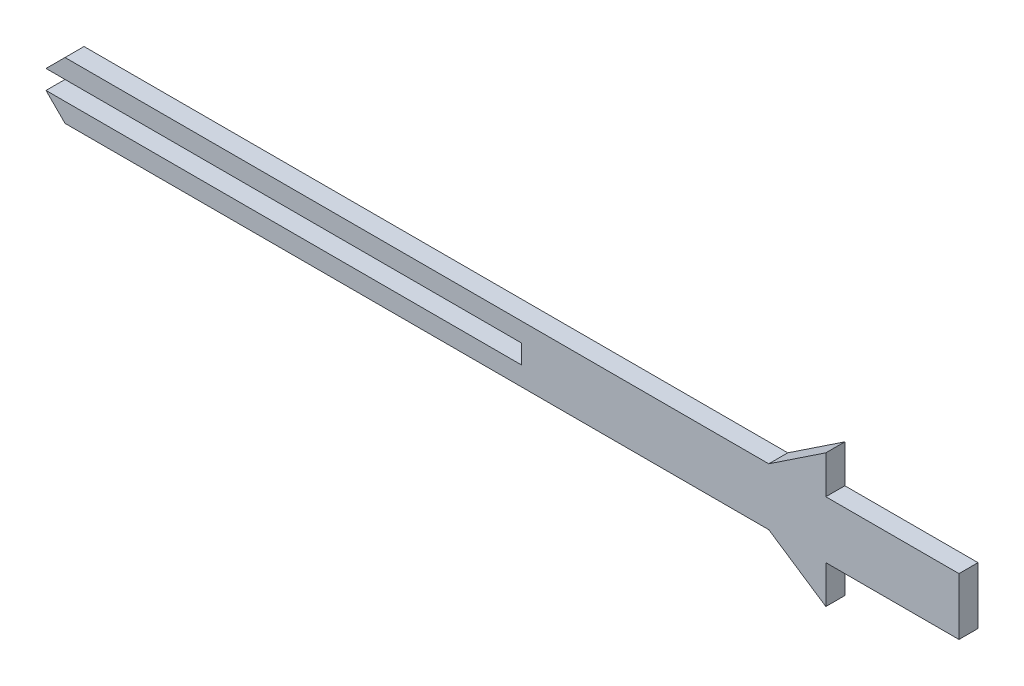
ISO-10303-21;
HEADER;
FILE_DESCRIPTION(('STEP AP214'),'2;1');
FILE_NAME('part.step','',(''),(''),'','','');
FILE_SCHEMA(('AUTOMOTIVE_DESIGN { 1 0 10303 214 1 1 1 1 }'));
ENDSEC;
DATA;
#1=APPLICATION_CONTEXT('core data for automotive mechanical design processes');
#2=APPLICATION_PROTOCOL_DEFINITION('international standard','automotive_design',2000,#1);
#3=PRODUCT_CONTEXT('',#1,'mechanical');
#4=PRODUCT('Part','Part','',(#3));
#5=PRODUCT_RELATED_PRODUCT_CATEGORY('part','',(#4));
#6=PRODUCT_DEFINITION_FORMATION('','',#4);
#7=PRODUCT_DEFINITION_CONTEXT('part definition',#1,'design');
#8=PRODUCT_DEFINITION('design','',#6,#7);
#9=PRODUCT_DEFINITION_SHAPE('','',#8);
#10=(LENGTH_UNIT() NAMED_UNIT(*) SI_UNIT(.MILLI.,.METRE.));
#11=(NAMED_UNIT(*) PLANE_ANGLE_UNIT() SI_UNIT($,.RADIAN.));
#12=(NAMED_UNIT(*) SI_UNIT($,.STERADIAN.) SOLID_ANGLE_UNIT());
#13=UNCERTAINTY_MEASURE_WITH_UNIT(LENGTH_MEASURE(1.E-05),#10,'distance_accuracy_value','');
#14=(GEOMETRIC_REPRESENTATION_CONTEXT(3) GLOBAL_UNCERTAINTY_ASSIGNED_CONTEXT((#13)) GLOBAL_UNIT_ASSIGNED_CONTEXT((#10,
#11,#12)) REPRESENTATION_CONTEXT('',''));
#15=CARTESIAN_POINT('',(0.,0.,0.));
#16=DIRECTION('',(0.,0.,1.));
#17=DIRECTION('',(1.,0.,0.));
#18=AXIS2_PLACEMENT_3D('',#15,#16,#17);
#19=CARTESIAN_POINT('',(346.292523509895,15.0172440967176,3.));
#20=DIRECTION('',(0.,1.,0.));
#21=DIRECTION('',(0.,0.,1.));
#22=AXIS2_PLACEMENT_3D('',#19,#20,#21);
#23=PLANE('',#22);
#24=DIRECTION('',(1.,0.,0.));
#25=VECTOR('',#24,1.);
#26=CARTESIAN_POINT('',(346.292523509895,15.0172440967176,0.));
#27=LINE('',#26,#25);
#28=CARTESIAN_POINT('',(346.292523509895,15.0172440967176,0.));
#29=VERTEX_POINT('',#28);
#30=CARTESIAN_POINT('',(421.292523509895,15.0172440967176,0.));
#31=VERTEX_POINT('',#30);
#32=EDGE_CURVE('E166',#29,#31,#27,.T.);
#33=ORIENTED_EDGE('',*,*,#32,.T.);
#34=DIRECTION('',(0.,0.,-1.));
#35=VECTOR('',#34,1.);
#36=CARTESIAN_POINT('',(421.292523509895,15.0172440967176,3.));
#37=LINE('',#36,#35);
#38=CARTESIAN_POINT('',(421.292523509895,15.0172440967176,3.));
#39=VERTEX_POINT('',#38);
#40=EDGE_CURVE('E11',#39,#31,#37,.T.);
#41=ORIENTED_EDGE('',*,*,#40,.F.);
#42=DIRECTION('',(1.,0.,0.));
#43=VECTOR('',#42,1.);
#44=CARTESIAN_POINT('',(346.292523509895,15.0172440967176,3.));
#45=LINE('',#44,#43);
#46=CARTESIAN_POINT('',(346.292523509895,15.0172440967176,3.));
#47=VERTEX_POINT('',#46);
#48=EDGE_CURVE('E192',#47,#39,#45,.T.);
#49=ORIENTED_EDGE('',*,*,#48,.F.);
#50=DIRECTION('',(0.,0.,-1.));
#51=VECTOR('',#50,1.);
#52=CARTESIAN_POINT('',(346.292523509895,15.0172440967176,3.));
#53=LINE('',#52,#51);
#54=EDGE_CURVE('E162',#47,#29,#53,.T.);
#55=ORIENTED_EDGE('',*,*,#54,.T.);
#56=EDGE_LOOP('',(#33,#41,#49,#55));
#57=FACE_BOUND('',#56,.T.);
#58=ADVANCED_FACE('F34',(#57),#23,.F.);
#59=CARTESIAN_POINT('',(421.292523509895,15.0172440967176,3.));
#60=DIRECTION('',(1.,0.,0.));
#61=DIRECTION('',(0.,0.,-1.));
#62=AXIS2_PLACEMENT_3D('',#59,#60,#61);
#63=PLANE('',#62);
#64=DIRECTION('',(0.,-1.,0.));
#65=VECTOR('',#64,1.);
#66=CARTESIAN_POINT('',(421.292523509895,15.0172440967176,0.));
#67=LINE('',#66,#65);
#68=CARTESIAN_POINT('',(421.292523509895,12.0172440967176,0.));
#69=VERTEX_POINT('',#68);
#70=EDGE_CURVE('E169',#31,#69,#67,.T.);
#71=ORIENTED_EDGE('',*,*,#70,.T.);
#72=DIRECTION('',(0.,0.,-1.));
#73=VECTOR('',#72,1.);
#74=CARTESIAN_POINT('',(421.292523509895,12.0172440967176,3.));
#75=LINE('',#74,#73);
#76=CARTESIAN_POINT('',(421.292523509895,12.0172440967176,3.));
#77=VERTEX_POINT('',#76);
#78=EDGE_CURVE('E42',#77,#69,#75,.T.);
#79=ORIENTED_EDGE('',*,*,#78,.F.);
#80=DIRECTION('',(0.,-1.,0.));
#81=VECTOR('',#80,1.);
#82=CARTESIAN_POINT('',(421.292523509895,15.0172440967176,3.));
#83=LINE('',#82,#81);
#84=EDGE_CURVE('E111',#39,#77,#83,.T.);
#85=ORIENTED_EDGE('',*,*,#84,.F.);
#86=ORIENTED_EDGE('',*,*,#40,.T.);
#87=EDGE_LOOP('',(#71,#79,#85,#86));
#88=FACE_BOUND('',#87,.T.);
#89=ADVANCED_FACE('F280',(#88),#63,.F.);
#90=CARTESIAN_POINT('',(421.292523509895,12.0172440967176,3.));
#91=DIRECTION('',(0.,-1.,0.));
#92=DIRECTION('',(0.,0.,-1.));
#93=AXIS2_PLACEMENT_3D('',#90,#91,#92);
#94=PLANE('',#93);
#95=DIRECTION('',(-1.,0.,0.));
#96=VECTOR('',#95,1.);
#97=CARTESIAN_POINT('',(421.292523509895,12.0172440967176,0.));
#98=LINE('',#97,#96);
#99=CARTESIAN_POINT('',(346.292523509895,12.0172440967176,0.));
#100=VERTEX_POINT('',#99);
#101=EDGE_CURVE('E171',#69,#100,#98,.T.);
#102=ORIENTED_EDGE('',*,*,#101,.T.);
#103=DIRECTION('',(0.,0.,-1.));
#104=VECTOR('',#103,1.);
#105=CARTESIAN_POINT('',(346.292523509895,12.0172440967176,3.));
#106=LINE('',#105,#104);
#107=CARTESIAN_POINT('',(346.292523509895,12.0172440967176,3.));
#108=VERTEX_POINT('',#107);
#109=EDGE_CURVE('E217',#108,#100,#106,.T.);
#110=ORIENTED_EDGE('',*,*,#109,.F.);
#111=DIRECTION('',(-1.,0.,0.));
#112=VECTOR('',#111,1.);
#113=CARTESIAN_POINT('',(421.292523509895,12.0172440967176,3.));
#114=LINE('',#113,#112);
#115=EDGE_CURVE('E225',#77,#108,#114,.T.);
#116=ORIENTED_EDGE('',*,*,#115,.F.);
#117=ORIENTED_EDGE('',*,*,#78,.T.);
#118=EDGE_LOOP('',(#102,#110,#116,#117));
#119=FACE_BOUND('',#118,.T.);
#120=ADVANCED_FACE('F223',(#119),#94,.F.);
#121=CARTESIAN_POINT('',(346.292523509895,12.0172440967176,3.));
#122=DIRECTION('',(0.707106781186547,0.707106781186548,0.));
#123=DIRECTION('',(-0.707106781186548,0.707106781186547,0.));
#124=AXIS2_PLACEMENT_3D('',#121,#122,#123);
#125=PLANE('',#124);
#126=DIRECTION('',(0.707106781186548,-0.707106781186547,0.));
#127=VECTOR('',#126,1.);
#128=CARTESIAN_POINT('',(346.292523509895,12.0172440967176,0.));
#129=LINE('',#128,#127);
#130=CARTESIAN_POINT('',(349.292523509895,9.0172440967176,0.));
#131=VERTEX_POINT('',#130);
#132=EDGE_CURVE('E173',#100,#131,#129,.T.);
#133=ORIENTED_EDGE('',*,*,#132,.T.);
#134=DIRECTION('',(0.,0.,-1.));
#135=VECTOR('',#134,1.);
#136=CARTESIAN_POINT('',(349.292523509895,9.0172440967176,3.));
#137=LINE('',#136,#135);
#138=CARTESIAN_POINT('',(349.292523509895,9.0172440967176,3.));
#139=VERTEX_POINT('',#138);
#140=EDGE_CURVE('E214',#139,#131,#137,.T.);
#141=ORIENTED_EDGE('',*,*,#140,.F.);
#142=DIRECTION('',(0.707106781186548,-0.707106781186547,0.));
#143=VECTOR('',#142,1.);
#144=CARTESIAN_POINT('',(346.292523509895,12.0172440967176,3.));
#145=LINE('',#144,#143);
#146=EDGE_CURVE('E243',#108,#139,#145,.T.);
#147=ORIENTED_EDGE('',*,*,#146,.F.);
#148=ORIENTED_EDGE('',*,*,#109,.T.);
#149=EDGE_LOOP('',(#133,#141,#147,#148));
#150=FACE_BOUND('',#149,.T.);
#151=ADVANCED_FACE('F234',(#150),#125,.F.);
#152=CARTESIAN_POINT('',(349.292523509895,9.0172440967176,3.));
#153=DIRECTION('',(0.,1.,0.));
#154=DIRECTION('',(0.,0.,1.));
#155=AXIS2_PLACEMENT_3D('',#152,#153,#154);
#156=PLANE('',#155);
#157=DIRECTION('',(1.,0.,0.));
#158=VECTOR('',#157,1.);
#159=CARTESIAN_POINT('',(349.292523509895,9.0172440967176,0.));
#160=LINE('',#159,#158);
#161=CARTESIAN_POINT('',(460.292523509895,9.0172440967176,0.));
#162=VERTEX_POINT('',#161);
#163=EDGE_CURVE('E175',#131,#162,#160,.T.);
#164=ORIENTED_EDGE('',*,*,#163,.T.);
#165=DIRECTION('',(0.,0.,-1.));
#166=VECTOR('',#165,1.);
#167=CARTESIAN_POINT('',(460.292523509895,9.0172440967176,3.));
#168=LINE('',#167,#166);
#169=CARTESIAN_POINT('',(460.292523509895,9.0172440967176,3.));
#170=VERTEX_POINT('',#169);
#171=EDGE_CURVE('E211',#170,#162,#168,.T.);
#172=ORIENTED_EDGE('',*,*,#171,.F.);
#173=DIRECTION('',(1.,0.,0.));
#174=VECTOR('',#173,1.);
#175=CARTESIAN_POINT('',(349.292523509895,9.0172440967176,3.));
#176=LINE('',#175,#174);
#177=EDGE_CURVE('E240',#139,#170,#176,.T.);
#178=ORIENTED_EDGE('',*,*,#177,.F.);
#179=ORIENTED_EDGE('',*,*,#140,.T.);
#180=EDGE_LOOP('',(#164,#172,#178,#179));
#181=FACE_BOUND('',#180,.T.);
#182=ADVANCED_FACE('F238',(#181),#156,.F.);
#183=CARTESIAN_POINT('',(460.292523509895,9.0172440967176,3.));
#184=DIRECTION('',(0.554700196225229,0.832050294337844,0.));
#185=DIRECTION('',(-0.832050294337844,0.554700196225229,0.));
#186=AXIS2_PLACEMENT_3D('',#183,#184,#185);
#187=PLANE('',#186);
#188=DIRECTION('',(0.832050294337844,-0.554700196225229,0.));
#189=VECTOR('',#188,1.);
#190=CARTESIAN_POINT('',(460.292523509895,9.0172440967176,0.));
#191=LINE('',#190,#189);
#192=CARTESIAN_POINT('',(469.292523509895,3.0172440967176,0.));
#193=VERTEX_POINT('',#192);
#194=EDGE_CURVE('E177',#162,#193,#191,.T.);
#195=ORIENTED_EDGE('',*,*,#194,.T.);
#196=DIRECTION('',(0.,0.,-1.));
#197=VECTOR('',#196,1.);
#198=CARTESIAN_POINT('',(469.292523509895,3.0172440967176,3.));
#199=LINE('',#198,#197);
#200=CARTESIAN_POINT('',(469.292523509895,3.0172440967176,3.));
#201=VERTEX_POINT('',#200);
#202=EDGE_CURVE('E208',#201,#193,#199,.T.);
#203=ORIENTED_EDGE('',*,*,#202,.F.);
#204=DIRECTION('',(0.832050294337844,-0.554700196225229,0.));
#205=VECTOR('',#204,1.);
#206=CARTESIAN_POINT('',(460.292523509895,9.0172440967176,3.));
#207=LINE('',#206,#205);
#208=EDGE_CURVE('E242',#170,#201,#207,.T.);
#209=ORIENTED_EDGE('',*,*,#208,.F.);
#210=ORIENTED_EDGE('',*,*,#171,.T.);
#211=EDGE_LOOP('',(#195,#203,#209,#210));
#212=FACE_BOUND('',#211,.T.);
#213=ADVANCED_FACE('F293',(#212),#187,.F.);
#214=CARTESIAN_POINT('',(469.292523509895,3.0172440967176,3.));
#215=DIRECTION('',(-1.,0.,0.));
#216=DIRECTION('',(0.,0.,1.));
#217=AXIS2_PLACEMENT_3D('',#214,#215,#216);
#218=PLANE('',#217);
#219=DIRECTION('',(0.,1.,0.));
#220=VECTOR('',#219,1.);
#221=CARTESIAN_POINT('',(469.292523509895,3.0172440967176,0.));
#222=LINE('',#221,#220);
#223=CARTESIAN_POINT('',(469.292523509895,9.0172440967176,0.));
#224=VERTEX_POINT('',#223);
#225=EDGE_CURVE('E179',#193,#224,#222,.T.);
#226=ORIENTED_EDGE('',*,*,#225,.T.);
#227=DIRECTION('',(0.,0.,-1.));
#228=VECTOR('',#227,1.);
#229=CARTESIAN_POINT('',(469.292523509895,9.0172440967176,3.));
#230=LINE('',#229,#228);
#231=CARTESIAN_POINT('',(469.292523509895,9.0172440967176,3.));
#232=VERTEX_POINT('',#231);
#233=EDGE_CURVE('E205',#232,#224,#230,.T.);
#234=ORIENTED_EDGE('',*,*,#233,.F.);
#235=DIRECTION('',(0.,1.,0.));
#236=VECTOR('',#235,1.);
#237=CARTESIAN_POINT('',(469.292523509895,3.0172440967176,3.));
#238=LINE('',#237,#236);
#239=EDGE_CURVE('E245',#201,#232,#238,.T.);
#240=ORIENTED_EDGE('',*,*,#239,.F.);
#241=ORIENTED_EDGE('',*,*,#202,.T.);
#242=EDGE_LOOP('',(#226,#234,#240,#241));
#243=FACE_BOUND('',#242,.T.);
#244=ADVANCED_FACE('F296',(#243),#218,.F.);
#245=CARTESIAN_POINT('',(469.292523509895,9.0172440967176,3.));
#246=DIRECTION('',(0.,1.,0.));
#247=DIRECTION('',(0.,0.,1.));
#248=AXIS2_PLACEMENT_3D('',#245,#246,#247);
#249=PLANE('',#248);
#250=DIRECTION('',(1.,0.,0.));
#251=VECTOR('',#250,1.);
#252=CARTESIAN_POINT('',(469.292523509895,9.0172440967176,0.));
#253=LINE('',#252,#251);
#254=CARTESIAN_POINT('',(490.292523509895,9.0172440967176,0.));
#255=VERTEX_POINT('',#254);
#256=EDGE_CURVE('E181',#224,#255,#253,.T.);
#257=ORIENTED_EDGE('',*,*,#256,.T.);
#258=DIRECTION('',(0.,0.,-1.));
#259=VECTOR('',#258,1.);
#260=CARTESIAN_POINT('',(490.292523509895,9.0172440967176,3.));
#261=LINE('',#260,#259);
#262=CARTESIAN_POINT('',(490.292523509895,9.0172440967176,3.));
#263=VERTEX_POINT('',#262);
#264=EDGE_CURVE('E202',#263,#255,#261,.T.);
#265=ORIENTED_EDGE('',*,*,#264,.F.);
#266=DIRECTION('',(1.,0.,0.));
#267=VECTOR('',#266,1.);
#268=CARTESIAN_POINT('',(469.292523509895,9.0172440967176,3.));
#269=LINE('',#268,#267);
#270=EDGE_CURVE('E251',#232,#263,#269,.T.);
#271=ORIENTED_EDGE('',*,*,#270,.F.);
#272=ORIENTED_EDGE('',*,*,#233,.T.);
#273=EDGE_LOOP('',(#257,#265,#271,#272));
#274=FACE_BOUND('',#273,.T.);
#275=ADVANCED_FACE('F300',(#274),#249,.F.);
#276=CARTESIAN_POINT('',(490.292523509895,9.0172440967176,3.));
#277=DIRECTION('',(-1.,0.,0.));
#278=DIRECTION('',(0.,0.,1.));
#279=AXIS2_PLACEMENT_3D('',#276,#277,#278);
#280=PLANE('',#279);
#281=DIRECTION('',(0.,1.,0.));
#282=VECTOR('',#281,1.);
#283=CARTESIAN_POINT('',(490.292523509895,9.0172440967176,0.));
#284=LINE('',#283,#282);
#285=CARTESIAN_POINT('',(490.292523509895,18.0172440967176,0.));
#286=VERTEX_POINT('',#285);
#287=EDGE_CURVE('E183',#255,#286,#284,.T.);
#288=ORIENTED_EDGE('',*,*,#287,.T.);
#289=DIRECTION('',(0.,0.,-1.));
#290=VECTOR('',#289,1.);
#291=CARTESIAN_POINT('',(490.292523509895,18.0172440967176,3.));
#292=LINE('',#291,#290);
#293=CARTESIAN_POINT('',(490.292523509895,18.0172440967176,3.));
#294=VERTEX_POINT('',#293);
#295=EDGE_CURVE('E199',#294,#286,#292,.T.);
#296=ORIENTED_EDGE('',*,*,#295,.F.);
#297=DIRECTION('',(0.,1.,0.));
#298=VECTOR('',#297,1.);
#299=CARTESIAN_POINT('',(490.292523509895,9.0172440967176,3.));
#300=LINE('',#299,#298);
#301=EDGE_CURVE('E253',#263,#294,#300,.T.);
#302=ORIENTED_EDGE('',*,*,#301,.F.);
#303=ORIENTED_EDGE('',*,*,#264,.T.);
#304=EDGE_LOOP('',(#288,#296,#302,#303));
#305=FACE_BOUND('',#304,.T.);
#306=ADVANCED_FACE('F304',(#305),#280,.F.);
#307=CARTESIAN_POINT('',(490.292523509895,18.0172440967176,3.));
#308=DIRECTION('',(0.,-1.,0.));
#309=DIRECTION('',(0.,0.,-1.));
#310=AXIS2_PLACEMENT_3D('',#307,#308,#309);
#311=PLANE('',#310);
#312=DIRECTION('',(-1.,0.,0.));
#313=VECTOR('',#312,1.);
#314=CARTESIAN_POINT('',(490.292523509895,18.0172440967176,0.));
#315=LINE('',#314,#313);
#316=CARTESIAN_POINT('',(469.292523509895,18.0172440967176,0.));
#317=VERTEX_POINT('',#316);
#318=EDGE_CURVE('E185',#286,#317,#315,.T.);
#319=ORIENTED_EDGE('',*,*,#318,.T.);
#320=DIRECTION('',(0.,0.,-1.));
#321=VECTOR('',#320,1.);
#322=CARTESIAN_POINT('',(469.292523509895,18.0172440967176,3.));
#323=LINE('',#322,#321);
#324=CARTESIAN_POINT('',(469.292523509895,18.0172440967176,3.));
#325=VERTEX_POINT('',#324);
#326=EDGE_CURVE('E196',#325,#317,#323,.T.);
#327=ORIENTED_EDGE('',*,*,#326,.F.);
#328=DIRECTION('',(-1.,0.,0.));
#329=VECTOR('',#328,1.);
#330=CARTESIAN_POINT('',(490.292523509895,18.0172440967176,3.));
#331=LINE('',#330,#329);
#332=EDGE_CURVE('E255',#294,#325,#331,.T.);
#333=ORIENTED_EDGE('',*,*,#332,.F.);
#334=ORIENTED_EDGE('',*,*,#295,.T.);
#335=EDGE_LOOP('',(#319,#327,#333,#334));
#336=FACE_BOUND('',#335,.T.);
#337=ADVANCED_FACE('F261',(#336),#311,.F.);
#338=CARTESIAN_POINT('',(469.292523509895,18.0172440967176,3.));
#339=DIRECTION('',(-1.,0.,0.));
#340=DIRECTION('',(0.,0.,1.));
#341=AXIS2_PLACEMENT_3D('',#338,#339,#340);
#342=PLANE('',#341);
#343=DIRECTION('',(0.,1.,0.));
#344=VECTOR('',#343,1.);
#345=CARTESIAN_POINT('',(469.292523509895,18.0172440967176,0.));
#346=LINE('',#345,#344);
#347=CARTESIAN_POINT('',(469.292523509895,24.0172440967176,0.));
#348=VERTEX_POINT('',#347);
#349=EDGE_CURVE('E187',#317,#348,#346,.T.);
#350=ORIENTED_EDGE('',*,*,#349,.T.);
#351=DIRECTION('',(0.,0.,-1.));
#352=VECTOR('',#351,1.);
#353=CARTESIAN_POINT('',(469.292523509895,24.0172440967176,3.));
#354=LINE('',#353,#352);
#355=CARTESIAN_POINT('',(469.292523509895,24.0172440967176,3.));
#356=VERTEX_POINT('',#355);
#357=EDGE_CURVE('E157',#356,#348,#354,.T.);
#358=ORIENTED_EDGE('',*,*,#357,.F.);
#359=DIRECTION('',(0.,1.,0.));
#360=VECTOR('',#359,1.);
#361=CARTESIAN_POINT('',(469.292523509895,18.0172440967176,3.));
#362=LINE('',#361,#360);
#363=EDGE_CURVE('E148',#325,#356,#362,.T.);
#364=ORIENTED_EDGE('',*,*,#363,.F.);
#365=ORIENTED_EDGE('',*,*,#326,.T.);
#366=EDGE_LOOP('',(#350,#358,#364,#365));
#367=FACE_BOUND('',#366,.T.);
#368=ADVANCED_FACE('F265',(#367),#342,.F.);
#369=CARTESIAN_POINT('',(469.292523509895,24.0172440967176,3.));
#370=DIRECTION('',(0.554700196225229,-0.832050294337844,0.));
#371=DIRECTION('',(0.832050294337844,0.554700196225229,0.));
#372=AXIS2_PLACEMENT_3D('',#369,#370,#371);
#373=PLANE('',#372);
#374=DIRECTION('',(-0.832050294337844,-0.554700196225229,0.));
#375=VECTOR('',#374,1.);
#376=CARTESIAN_POINT('',(469.292523509895,24.0172440967176,0.));
#377=LINE('',#376,#375);
#378=CARTESIAN_POINT('',(460.292523509895,18.0172440967176,0.));
#379=VERTEX_POINT('',#378);
#380=EDGE_CURVE('E156',#348,#379,#377,.T.);
#381=ORIENTED_EDGE('',*,*,#380,.T.);
#382=DIRECTION('',(0.,0.,-1.));
#383=VECTOR('',#382,1.);
#384=CARTESIAN_POINT('',(460.292523509895,18.0172440967176,3.));
#385=LINE('',#384,#383);
#386=CARTESIAN_POINT('',(460.292523509895,18.0172440967176,3.));
#387=VERTEX_POINT('',#386);
#388=EDGE_CURVE('E153',#387,#379,#385,.T.);
#389=ORIENTED_EDGE('',*,*,#388,.F.);
#390=DIRECTION('',(-0.832050294337844,-0.554700196225229,0.));
#391=VECTOR('',#390,1.);
#392=CARTESIAN_POINT('',(469.292523509895,24.0172440967176,3.));
#393=LINE('',#392,#391);
#394=EDGE_CURVE('E142',#356,#387,#393,.T.);
#395=ORIENTED_EDGE('',*,*,#394,.F.);
#396=ORIENTED_EDGE('',*,*,#357,.T.);
#397=EDGE_LOOP('',(#381,#389,#395,#396));
#398=FACE_BOUND('',#397,.T.);
#399=ADVANCED_FACE('F154',(#398),#373,.F.);
#400=CARTESIAN_POINT('',(460.292523509895,18.0172440967176,3.));
#401=DIRECTION('',(0.,-1.,0.));
#402=DIRECTION('',(0.,0.,-1.));
#403=AXIS2_PLACEMENT_3D('',#400,#401,#402);
#404=PLANE('',#403);
#405=DIRECTION('',(-1.,0.,0.));
#406=VECTOR('',#405,1.);
#407=CARTESIAN_POINT('',(460.292523509895,18.0172440967176,0.));
#408=LINE('',#407,#406);
#409=CARTESIAN_POINT('',(349.292523509895,18.0172440967176,0.));
#410=VERTEX_POINT('',#409);
#411=EDGE_CURVE('E97',#379,#410,#408,.T.);
#412=ORIENTED_EDGE('',*,*,#411,.T.);
#413=DIRECTION('',(0.,0.,-1.));
#414=VECTOR('',#413,1.);
#415=CARTESIAN_POINT('',(349.292523509895,18.0172440967176,3.));
#416=LINE('',#415,#414);
#417=CARTESIAN_POINT('',(349.292523509895,18.0172440967176,3.));
#418=VERTEX_POINT('',#417);
#419=EDGE_CURVE('E158',#418,#410,#416,.T.);
#420=ORIENTED_EDGE('',*,*,#419,.F.);
#421=DIRECTION('',(-1.,0.,0.));
#422=VECTOR('',#421,1.);
#423=CARTESIAN_POINT('',(460.292523509895,18.0172440967176,3.));
#424=LINE('',#423,#422);
#425=EDGE_CURVE('E146',#387,#418,#424,.T.);
#426=ORIENTED_EDGE('',*,*,#425,.F.);
#427=ORIENTED_EDGE('',*,*,#388,.T.);
#428=EDGE_LOOP('',(#412,#420,#426,#427));
#429=FACE_BOUND('',#428,.T.);
#430=ADVANCED_FACE('F160',(#429),#404,.F.);
#431=CARTESIAN_POINT('',(349.292523509895,18.0172440967176,3.));
#432=DIRECTION('',(0.707106781186547,-0.707106781186548,0.));
#433=DIRECTION('',(0.707106781186548,0.707106781186547,0.));
#434=AXIS2_PLACEMENT_3D('',#431,#432,#433);
#435=PLANE('',#434);
#436=DIRECTION('',(-0.707106781186548,-0.707106781186547,0.));
#437=VECTOR('',#436,1.);
#438=CARTESIAN_POINT('',(349.292523509895,18.0172440967176,0.));
#439=LINE('',#438,#437);
#440=EDGE_CURVE('E103',#410,#29,#439,.T.);
#441=ORIENTED_EDGE('',*,*,#440,.T.);
#442=ORIENTED_EDGE('',*,*,#54,.F.);
#443=DIRECTION('',(-0.707106781186548,-0.707106781186547,0.));
#444=VECTOR('',#443,1.);
#445=CARTESIAN_POINT('',(349.292523509895,18.0172440967176,3.));
#446=LINE('',#445,#444);
#447=EDGE_CURVE('E50',#418,#47,#446,.T.);
#448=ORIENTED_EDGE('',*,*,#447,.F.);
#449=ORIENTED_EDGE('',*,*,#419,.T.);
#450=EDGE_LOOP('',(#441,#442,#448,#449));
#451=FACE_BOUND('',#450,.T.);
#452=ADVANCED_FACE('F269',(#451),#435,.F.);
#453=CARTESIAN_POINT('',(0.,0.,3.));
#454=DIRECTION('',(0.,0.,-1.));
#455=DIRECTION('',(-1.,0.,0.));
#456=AXIS2_PLACEMENT_3D('',#453,#454,#455);
#457=PLANE('',#456);
#458=ORIENTED_EDGE('',*,*,#48,.T.);
#459=ORIENTED_EDGE('',*,*,#84,.T.);
#460=ORIENTED_EDGE('',*,*,#115,.T.);
#461=ORIENTED_EDGE('',*,*,#146,.T.);
#462=ORIENTED_EDGE('',*,*,#177,.T.);
#463=ORIENTED_EDGE('',*,*,#208,.T.);
#464=ORIENTED_EDGE('',*,*,#239,.T.);
#465=ORIENTED_EDGE('',*,*,#270,.T.);
#466=ORIENTED_EDGE('',*,*,#301,.T.);
#467=ORIENTED_EDGE('',*,*,#332,.T.);
#468=ORIENTED_EDGE('',*,*,#363,.T.);
#469=ORIENTED_EDGE('',*,*,#394,.T.);
#470=ORIENTED_EDGE('',*,*,#425,.T.);
#471=ORIENTED_EDGE('',*,*,#447,.T.);
#472=EDGE_LOOP('',(#458,#459,#460,#461,#462,#463,#464,#465,#466,#467,#468,#469,#470,#471));
#473=FACE_BOUND('',#472,.T.);
#474=ADVANCED_FACE('F144',(#473),#457,.F.);
#475=CARTESIAN_POINT('',(0.,0.,0.));
#476=DIRECTION('',(0.,0.,-1.));
#477=DIRECTION('',(-1.,0.,0.));
#478=AXIS2_PLACEMENT_3D('',#475,#476,#477);
#479=PLANE('',#478);
#480=ORIENTED_EDGE('',*,*,#32,.F.);
#481=ORIENTED_EDGE('',*,*,#440,.F.);
#482=ORIENTED_EDGE('',*,*,#411,.F.);
#483=ORIENTED_EDGE('',*,*,#380,.F.);
#484=ORIENTED_EDGE('',*,*,#349,.F.);
#485=ORIENTED_EDGE('',*,*,#318,.F.);
#486=ORIENTED_EDGE('',*,*,#287,.F.);
#487=ORIENTED_EDGE('',*,*,#256,.F.);
#488=ORIENTED_EDGE('',*,*,#225,.F.);
#489=ORIENTED_EDGE('',*,*,#194,.F.);
#490=ORIENTED_EDGE('',*,*,#163,.F.);
#491=ORIENTED_EDGE('',*,*,#132,.F.);
#492=ORIENTED_EDGE('',*,*,#101,.F.);
#493=ORIENTED_EDGE('',*,*,#70,.F.);
#494=EDGE_LOOP('',(#480,#481,#482,#483,#484,#485,#486,#487,#488,#489,#490,#491,#492,#493));
#495=FACE_BOUND('',#494,.T.);
#496=ADVANCED_FACE('F229',(#495),#479,.T.);
#497=CLOSED_SHELL('',(#58,#89,#120,#151,#182,#213,#244,#275,#306,#337,#368,#399,#430,#452,#474,#496));
#498=MANIFOLD_SOLID_BREP('B2',#497);
#499=ADVANCED_BREP_SHAPE_REPRESENTATION('',(#18,#498),#14);
#500=SHAPE_DEFINITION_REPRESENTATION(#9,#499);
ENDSEC;
END-ISO-10303-21;
